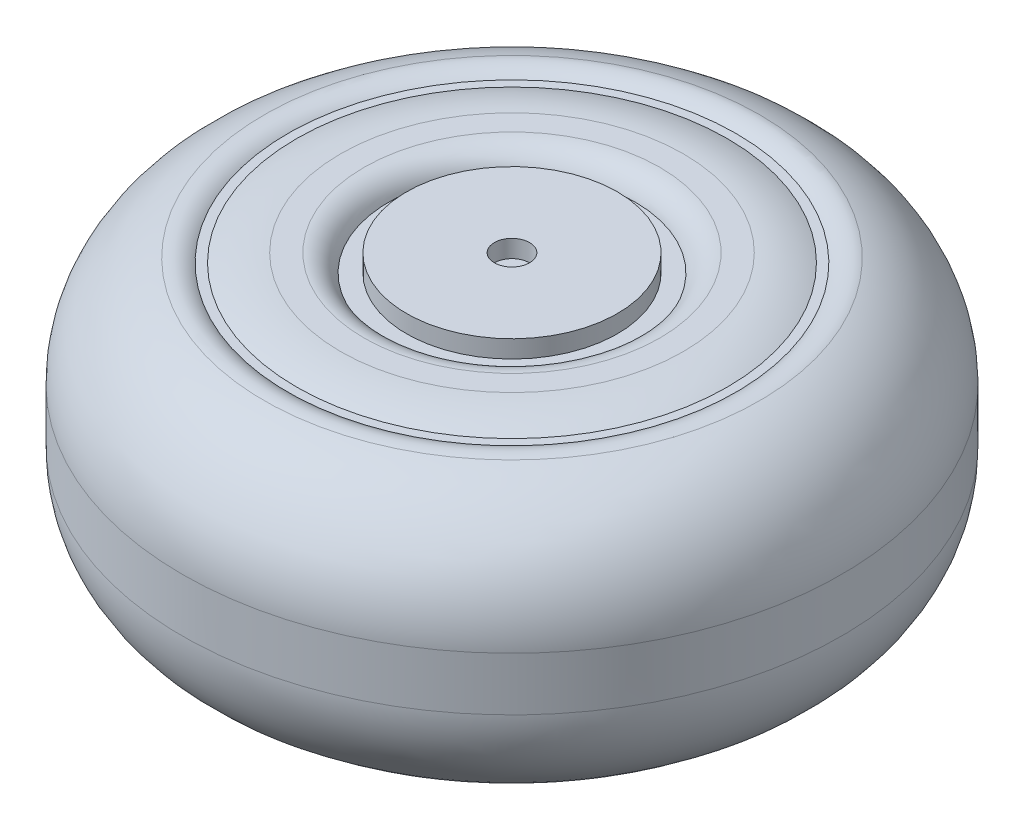
ISO-10303-21;
HEADER;
FILE_DESCRIPTION(('STEP AP214'),'2;1');
FILE_NAME('part.step','',(''),(''),'','','');
FILE_SCHEMA(('AUTOMOTIVE_DESIGN { 1 0 10303 214 1 1 1 1 }'));
ENDSEC;
DATA;
#1=APPLICATION_CONTEXT('core data for automotive mechanical design processes');
#2=APPLICATION_PROTOCOL_DEFINITION('international standard','automotive_design',2000,#1);
#3=PRODUCT_CONTEXT('',#1,'mechanical');
#4=PRODUCT('Part','Part','',(#3));
#5=PRODUCT_RELATED_PRODUCT_CATEGORY('part','',(#4));
#6=PRODUCT_DEFINITION_FORMATION('','',#4);
#7=PRODUCT_DEFINITION_CONTEXT('part definition',#1,'design');
#8=PRODUCT_DEFINITION('design','',#6,#7);
#9=PRODUCT_DEFINITION_SHAPE('','',#8);
#10=(LENGTH_UNIT() NAMED_UNIT(*) SI_UNIT(.MILLI.,.METRE.));
#11=(NAMED_UNIT(*) PLANE_ANGLE_UNIT() SI_UNIT($,.RADIAN.));
#12=(NAMED_UNIT(*) SI_UNIT($,.STERADIAN.) SOLID_ANGLE_UNIT());
#13=UNCERTAINTY_MEASURE_WITH_UNIT(LENGTH_MEASURE(1.E-05),#10,'distance_accuracy_value','');
#14=(GEOMETRIC_REPRESENTATION_CONTEXT(3) GLOBAL_UNCERTAINTY_ASSIGNED_CONTEXT((#13)) GLOBAL_UNIT_ASSIGNED_CONTEXT((#10,
#11,#12)) REPRESENTATION_CONTEXT('',''));
#15=CARTESIAN_POINT('',(0.,0.,0.));
#16=DIRECTION('',(0.,0.,1.));
#17=DIRECTION('',(1.,0.,0.));
#18=AXIS2_PLACEMENT_3D('',#15,#16,#17);
#19=CARTESIAN_POINT('',(0.,2.,-37.5));
#20=DIRECTION('',(0.,-1.,0.));
#21=DIRECTION('',(0.,0.,-1.));
#22=AXIS2_PLACEMENT_3D('',#19,#20,#21);
#23=CYLINDRICAL_SURFACE('',#22,25.5);
#24=CARTESIAN_POINT('',(0.,1.,-37.5));
#25=DIRECTION('',(0.,-1.,0.));
#26=DIRECTION('',(0.,0.,-1.));
#27=AXIS2_PLACEMENT_3D('',#24,#25,#26);
#28=CIRCLE('',#27,25.5);
#29=CARTESIAN_POINT('',(0.,1.,-63.));
#30=VERTEX_POINT('',#29);
#31=EDGE_CURVE('E63',#30,#30,#28,.T.);
#32=ORIENTED_EDGE('',*,*,#31,.F.);
#33=EDGE_LOOP('',(#32));
#34=FACE_BOUND('',#33,.T.);
#35=CARTESIAN_POINT('',(0.,0.,-37.5));
#36=DIRECTION('',(0.,-1.,0.));
#37=DIRECTION('',(0.,0.,-1.));
#38=AXIS2_PLACEMENT_3D('',#35,#36,#37);
#39=CIRCLE('',#38,25.5);
#40=CARTESIAN_POINT('',(0.,0.,-63.));
#41=VERTEX_POINT('',#40);
#42=EDGE_CURVE('E60',#41,#41,#39,.T.);
#43=ORIENTED_EDGE('',*,*,#42,.T.);
#44=EDGE_LOOP('',(#43));
#45=FACE_BOUND('',#44,.T.);
#46=ADVANCED_FACE('F34',(#34,#45),#23,.F.);
#47=CARTESIAN_POINT('',(0.,1.,-12.));
#48=DIRECTION('',(0.,1.,0.));
#49=DIRECTION('',(0.,0.,1.));
#50=AXIS2_PLACEMENT_3D('',#47,#48,#49);
#51=PLANE('',#50);
#52=CARTESIAN_POINT('',(0.,1.,-37.5));
#53=DIRECTION('',(0.,-1.,0.));
#54=DIRECTION('',(0.,0.,-1.));
#55=AXIS2_PLACEMENT_3D('',#52,#53,#54);
#56=CIRCLE('',#55,24.5);
#57=CARTESIAN_POINT('',(0.,1.,-62.));
#58=VERTEX_POINT('',#57);
#59=EDGE_CURVE('E66',#58,#58,#56,.T.);
#60=ORIENTED_EDGE('',*,*,#59,.F.);
#61=EDGE_LOOP('',(#60));
#62=FACE_BOUND('',#61,.T.);
#63=ORIENTED_EDGE('',*,*,#31,.T.);
#64=EDGE_LOOP('',(#63));
#65=FACE_BOUND('',#64,.T.);
#66=ADVANCED_FACE('F135',(#62,#65),#51,.F.);
#67=CARTESIAN_POINT('',(0.,0.,-13.));
#68=DIRECTION('',(0.,1.,0.));
#69=DIRECTION('',(0.,0.,1.));
#70=AXIS2_PLACEMENT_3D('',#67,#68,#69);
#71=PLANE('',#70);
#72=CARTESIAN_POINT('',(0.,0.,-37.5));
#73=DIRECTION('',(0.,1.,0.));
#74=DIRECTION('',(0.,0.,1.));
#75=AXIS2_PLACEMENT_3D('',#72,#73,#74);
#76=CIRCLE('',#75,19.5);
#77=CARTESIAN_POINT('',(0.,0.,-18.));
#78=VERTEX_POINT('',#77);
#79=EDGE_CURVE('E49',#78,#78,#76,.F.);
#80=ORIENTED_EDGE('',*,*,#79,.T.);
#81=EDGE_LOOP('',(#80));
#82=FACE_BOUND('',#81,.T.);
#83=CARTESIAN_POINT('',(0.,0.,-37.5));
#84=DIRECTION('',(0.,-1.,0.));
#85=DIRECTION('',(0.,0.,-1.));
#86=AXIS2_PLACEMENT_3D('',#83,#84,#85);
#87=CIRCLE('',#86,14.);
#88=CARTESIAN_POINT('',(0.,0.,-51.5));
#89=VERTEX_POINT('',#88);
#90=EDGE_CURVE('E69',#89,#89,#87,.T.);
#91=ORIENTED_EDGE('',*,*,#90,.F.);
#92=EDGE_LOOP('',(#91));
#93=FACE_BOUND('',#92,.T.);
#94=ADVANCED_FACE('F141',(#82,#93),#71,.F.);
#95=CARTESIAN_POINT('',(0.,2.,-37.5));
#96=DIRECTION('',(0.,-1.,0.));
#97=DIRECTION('',(0.,0.,-1.));
#98=AXIS2_PLACEMENT_3D('',#95,#96,#97);
#99=CYLINDRICAL_SURFACE('',#98,14.);
#100=CARTESIAN_POINT('',(0.,2.,-37.5));
#101=DIRECTION('',(0.,-1.,0.));
#102=DIRECTION('',(0.,0.,-1.));
#103=AXIS2_PLACEMENT_3D('',#100,#101,#102);
#104=CIRCLE('',#103,14.);
#105=CARTESIAN_POINT('',(0.,2.,-51.5));
#106=VERTEX_POINT('',#105);
#107=EDGE_CURVE('E72',#106,#106,#104,.T.);
#108=ORIENTED_EDGE('',*,*,#107,.F.);
#109=EDGE_LOOP('',(#108));
#110=FACE_BOUND('',#109,.T.);
#111=ORIENTED_EDGE('',*,*,#90,.T.);
#112=EDGE_LOOP('',(#111));
#113=FACE_BOUND('',#112,.T.);
#114=ADVANCED_FACE('F205',(#110,#113),#99,.F.);
#115=CARTESIAN_POINT('',(0.,2.,-23.5));
#116=DIRECTION('',(0.,1.,0.));
#117=DIRECTION('',(0.,0.,1.));
#118=AXIS2_PLACEMENT_3D('',#115,#116,#117);
#119=PLANE('',#118);
#120=CARTESIAN_POINT('',(0.,2.,-37.5));
#121=DIRECTION('',(0.,-1.,0.));
#122=DIRECTION('',(0.,0.,-1.));
#123=AXIS2_PLACEMENT_3D('',#120,#121,#122);
#124=CIRCLE('',#123,12.);
#125=CARTESIAN_POINT('',(0.,2.,-49.5));
#126=VERTEX_POINT('',#125);
#127=EDGE_CURVE('E75',#126,#126,#124,.T.);
#128=ORIENTED_EDGE('',*,*,#127,.F.);
#129=EDGE_LOOP('',(#128));
#130=FACE_BOUND('',#129,.T.);
#131=ORIENTED_EDGE('',*,*,#107,.T.);
#132=EDGE_LOOP('',(#131));
#133=FACE_BOUND('',#132,.T.);
#134=ADVANCED_FACE('F201',(#130,#133),#119,.F.);
#135=CARTESIAN_POINT('',(0.,2.,-37.5));
#136=DIRECTION('',(0.,-1.,0.));
#137=DIRECTION('',(0.,0.,-1.));
#138=AXIS2_PLACEMENT_3D('',#135,#136,#137);
#139=CYLINDRICAL_SURFACE('',#138,12.);
#140=CARTESIAN_POINT('',(0.,0.,-37.5));
#141=DIRECTION('',(0.,-1.,0.));
#142=DIRECTION('',(0.,0.,-1.));
#143=AXIS2_PLACEMENT_3D('',#140,#141,#142);
#144=CIRCLE('',#143,12.);
#145=CARTESIAN_POINT('',(0.,0.,-49.5));
#146=VERTEX_POINT('',#145);
#147=EDGE_CURVE('E78',#146,#146,#144,.T.);
#148=ORIENTED_EDGE('',*,*,#147,.F.);
#149=EDGE_LOOP('',(#148));
#150=FACE_BOUND('',#149,.T.);
#151=ORIENTED_EDGE('',*,*,#127,.T.);
#152=EDGE_LOOP('',(#151));
#153=FACE_BOUND('',#152,.T.);
#154=ADVANCED_FACE('F197',(#150,#153),#139,.T.);
#155=CARTESIAN_POINT('',(0.,0.,-25.5));
#156=DIRECTION('',(0.,1.,0.));
#157=DIRECTION('',(0.,0.,1.));
#158=AXIS2_PLACEMENT_3D('',#155,#156,#157);
#159=PLANE('',#158);
#160=CARTESIAN_POINT('',(0.,0.,-37.5));
#161=DIRECTION('',(0.,-1.,0.));
#162=DIRECTION('',(0.,0.,-1.));
#163=AXIS2_PLACEMENT_3D('',#160,#161,#162);
#164=CIRCLE('',#163,2.);
#165=CARTESIAN_POINT('',(0.,0.,-39.5));
#166=VERTEX_POINT('',#165);
#167=EDGE_CURVE('E81',#166,#166,#164,.T.);
#168=ORIENTED_EDGE('',*,*,#167,.F.);
#169=EDGE_LOOP('',(#168));
#170=FACE_BOUND('',#169,.T.);
#171=ORIENTED_EDGE('',*,*,#147,.T.);
#172=EDGE_LOOP('',(#171));
#173=FACE_BOUND('',#172,.T.);
#174=ADVANCED_FACE('F193',(#170,#173),#159,.F.);
#175=CARTESIAN_POINT('',(0.,2.,-37.5));
#176=DIRECTION('',(0.,-1.,0.));
#177=DIRECTION('',(0.,0.,-1.));
#178=AXIS2_PLACEMENT_3D('',#175,#176,#177);
#179=CYLINDRICAL_SURFACE('',#178,2.);
#180=CARTESIAN_POINT('',(0.,2.,-37.5));
#181=DIRECTION('',(0.,-1.,0.));
#182=DIRECTION('',(0.,0.,-1.));
#183=AXIS2_PLACEMENT_3D('',#180,#181,#182);
#184=CIRCLE('',#183,2.);
#185=CARTESIAN_POINT('',(0.,2.,-39.5));
#186=VERTEX_POINT('',#185);
#187=EDGE_CURVE('E84',#186,#186,#184,.T.);
#188=ORIENTED_EDGE('',*,*,#187,.F.);
#189=EDGE_LOOP('',(#188));
#190=FACE_BOUND('',#189,.T.);
#191=ORIENTED_EDGE('',*,*,#167,.T.);
#192=EDGE_LOOP('',(#191));
#193=FACE_BOUND('',#192,.T.);
#194=ADVANCED_FACE('F189',(#190,#193),#179,.F.);
#195=CARTESIAN_POINT('',(0.,2.,-37.5));
#196=DIRECTION('',(0.,1.,0.));
#197=DIRECTION('',(0.,0.,1.));
#198=AXIS2_PLACEMENT_3D('',#195,#196,#197);
#199=PLANE('',#198);
#200=ORIENTED_EDGE('',*,*,#187,.T.);
#201=EDGE_LOOP('',(#200));
#202=FACE_BOUND('',#201,.T.);
#203=ADVANCED_FACE('F185',(#202),#199,.F.);
#204=CARTESIAN_POINT('',(0.,30.,-37.5));
#205=DIRECTION('',(0.,-1.,0.));
#206=DIRECTION('',(0.,0.,-1.));
#207=AXIS2_PLACEMENT_3D('',#204,#205,#206);
#208=PLANE('',#207);
#209=CARTESIAN_POINT('',(0.,30.,-37.5));
#210=DIRECTION('',(0.,-1.,0.));
#211=DIRECTION('',(0.,0.,-1.));
#212=AXIS2_PLACEMENT_3D('',#209,#210,#211);
#213=CIRCLE('',#212,2.);
#214=CARTESIAN_POINT('',(0.,30.,-39.5));
#215=VERTEX_POINT('',#214);
#216=EDGE_CURVE('E87',#215,#215,#213,.T.);
#217=ORIENTED_EDGE('',*,*,#216,.F.);
#218=EDGE_LOOP('',(#217));
#219=FACE_BOUND('',#218,.T.);
#220=ADVANCED_FACE('F181',(#219),#208,.F.);
#221=CARTESIAN_POINT('',(0.,2.,-37.5));
#222=DIRECTION('',(0.,-1.,0.));
#223=DIRECTION('',(0.,0.,-1.));
#224=AXIS2_PLACEMENT_3D('',#221,#222,#223);
#225=CYLINDRICAL_SURFACE('',#224,2.);
#226=CARTESIAN_POINT('',(0.,32.,-37.5));
#227=DIRECTION('',(0.,-1.,0.));
#228=DIRECTION('',(0.,0.,-1.));
#229=AXIS2_PLACEMENT_3D('',#226,#227,#228);
#230=CIRCLE('',#229,2.);
#231=CARTESIAN_POINT('',(0.,32.,-39.5));
#232=VERTEX_POINT('',#231);
#233=EDGE_CURVE('E90',#232,#232,#230,.T.);
#234=ORIENTED_EDGE('',*,*,#233,.F.);
#235=EDGE_LOOP('',(#234));
#236=FACE_BOUND('',#235,.T.);
#237=ORIENTED_EDGE('',*,*,#216,.T.);
#238=EDGE_LOOP('',(#237));
#239=FACE_BOUND('',#238,.T.);
#240=ADVANCED_FACE('F177',(#236,#239),#225,.F.);
#241=CARTESIAN_POINT('',(0.,32.,-25.5));
#242=DIRECTION('',(0.,-1.,0.));
#243=DIRECTION('',(0.,0.,-1.));
#244=AXIS2_PLACEMENT_3D('',#241,#242,#243);
#245=PLANE('',#244);
#246=CARTESIAN_POINT('',(0.,32.,-37.5));
#247=DIRECTION('',(0.,-1.,0.));
#248=DIRECTION('',(0.,0.,-1.));
#249=AXIS2_PLACEMENT_3D('',#246,#247,#248);
#250=CIRCLE('',#249,12.);
#251=CARTESIAN_POINT('',(0.,32.,-49.5));
#252=VERTEX_POINT('',#251);
#253=EDGE_CURVE('E93',#252,#252,#250,.T.);
#254=ORIENTED_EDGE('',*,*,#253,.F.);
#255=EDGE_LOOP('',(#254));
#256=FACE_BOUND('',#255,.T.);
#257=ORIENTED_EDGE('',*,*,#233,.T.);
#258=EDGE_LOOP('',(#257));
#259=FACE_BOUND('',#258,.T.);
#260=ADVANCED_FACE('F173',(#256,#259),#245,.F.);
#261=CARTESIAN_POINT('',(0.,2.,-37.5));
#262=DIRECTION('',(0.,-1.,0.));
#263=DIRECTION('',(0.,0.,-1.));
#264=AXIS2_PLACEMENT_3D('',#261,#262,#263);
#265=CYLINDRICAL_SURFACE('',#264,12.);
#266=CARTESIAN_POINT('',(0.,30.,-37.5));
#267=DIRECTION('',(0.,-1.,0.));
#268=DIRECTION('',(0.,0.,-1.));
#269=AXIS2_PLACEMENT_3D('',#266,#267,#268);
#270=CIRCLE('',#269,12.);
#271=CARTESIAN_POINT('',(0.,30.,-49.5));
#272=VERTEX_POINT('',#271);
#273=EDGE_CURVE('E96',#272,#272,#270,.T.);
#274=ORIENTED_EDGE('',*,*,#273,.F.);
#275=EDGE_LOOP('',(#274));
#276=FACE_BOUND('',#275,.T.);
#277=ORIENTED_EDGE('',*,*,#253,.T.);
#278=EDGE_LOOP('',(#277));
#279=FACE_BOUND('',#278,.T.);
#280=ADVANCED_FACE('F169',(#276,#279),#265,.T.);
#281=CARTESIAN_POINT('',(0.,30.,-23.5));
#282=DIRECTION('',(0.,-1.,0.));
#283=DIRECTION('',(0.,0.,-1.));
#284=AXIS2_PLACEMENT_3D('',#281,#282,#283);
#285=PLANE('',#284);
#286=CARTESIAN_POINT('',(0.,30.,-37.5));
#287=DIRECTION('',(0.,-1.,0.));
#288=DIRECTION('',(0.,0.,-1.));
#289=AXIS2_PLACEMENT_3D('',#286,#287,#288);
#290=CIRCLE('',#289,14.);
#291=CARTESIAN_POINT('',(0.,30.,-51.5));
#292=VERTEX_POINT('',#291);
#293=EDGE_CURVE('E99',#292,#292,#290,.T.);
#294=ORIENTED_EDGE('',*,*,#293,.F.);
#295=EDGE_LOOP('',(#294));
#296=FACE_BOUND('',#295,.T.);
#297=ORIENTED_EDGE('',*,*,#273,.T.);
#298=EDGE_LOOP('',(#297));
#299=FACE_BOUND('',#298,.T.);
#300=ADVANCED_FACE('F166',(#296,#299),#285,.F.);
#301=CARTESIAN_POINT('',(0.,32.,-13.));
#302=DIRECTION('',(0.,-1.,0.));
#303=DIRECTION('',(0.,0.,-1.));
#304=AXIS2_PLACEMENT_3D('',#301,#302,#303);
#305=PLANE('',#304);
#306=CARTESIAN_POINT('',(0.,32.,-37.5));
#307=DIRECTION('',(0.,-1.,0.));
#308=DIRECTION('',(0.,0.,-1.));
#309=AXIS2_PLACEMENT_3D('',#306,#307,#308);
#310=CIRCLE('',#309,16.8284271247462);
#311=CARTESIAN_POINT('',(0.,32.,-54.3284271247462));
#312=VERTEX_POINT('',#311);
#313=EDGE_CURVE('E41',#312,#312,#310,.T.);
#314=ORIENTED_EDGE('',*,*,#313,.T.);
#315=EDGE_LOOP('',(#314));
#316=FACE_BOUND('',#315,.T.);
#317=CARTESIAN_POINT('',(0.,32.,-37.5));
#318=DIRECTION('',(0.,-1.,0.));
#319=DIRECTION('',(0.,0.,-1.));
#320=AXIS2_PLACEMENT_3D('',#317,#318,#319);
#321=CIRCLE('',#320,19.5);
#322=CARTESIAN_POINT('',(0.,32.,-57.));
#323=VERTEX_POINT('',#322);
#324=EDGE_CURVE('E45',#323,#323,#321,.F.);
#325=ORIENTED_EDGE('',*,*,#324,.T.);
#326=EDGE_LOOP('',(#325));
#327=FACE_BOUND('',#326,.T.);
#328=ADVANCED_FACE('F115',(#316,#327),#305,.F.);
#329=CARTESIAN_POINT('',(0.,31.,-12.));
#330=DIRECTION('',(0.,-1.,0.));
#331=DIRECTION('',(0.,0.,-1.));
#332=AXIS2_PLACEMENT_3D('',#329,#330,#331);
#333=PLANE('',#332);
#334=CARTESIAN_POINT('',(0.,31.,-37.5));
#335=DIRECTION('',(0.,-1.,0.));
#336=DIRECTION('',(0.,0.,-1.));
#337=AXIS2_PLACEMENT_3D('',#334,#335,#336);
#338=CIRCLE('',#337,25.5);
#339=CARTESIAN_POINT('',(0.,31.,-63.));
#340=VERTEX_POINT('',#339);
#341=EDGE_CURVE('E105',#340,#340,#338,.T.);
#342=ORIENTED_EDGE('',*,*,#341,.F.);
#343=EDGE_LOOP('',(#342));
#344=FACE_BOUND('',#343,.T.);
#345=CARTESIAN_POINT('',(0.,31.,-37.5));
#346=DIRECTION('',(0.,-1.,0.));
#347=DIRECTION('',(0.,0.,-1.));
#348=AXIS2_PLACEMENT_3D('',#345,#346,#347);
#349=CIRCLE('',#348,24.5);
#350=CARTESIAN_POINT('',(0.,31.,-62.));
#351=VERTEX_POINT('',#350);
#352=EDGE_CURVE('E102',#351,#351,#349,.T.);
#353=ORIENTED_EDGE('',*,*,#352,.T.);
#354=EDGE_LOOP('',(#353));
#355=FACE_BOUND('',#354,.T.);
#356=ADVANCED_FACE('F111',(#344,#355),#333,.F.);
#357=CARTESIAN_POINT('',(0.,2.,-37.5));
#358=DIRECTION('',(0.,-1.,0.));
#359=DIRECTION('',(0.,0.,-1.));
#360=AXIS2_PLACEMENT_3D('',#357,#358,#359);
#361=CYLINDRICAL_SURFACE('',#360,37.5);
#362=CARTESIAN_POINT('',(0.,12.9614813968157,-37.5));
#363=DIRECTION('',(0.,-1.,0.));
#364=DIRECTION('',(0.,0.,-1.));
#365=AXIS2_PLACEMENT_3D('',#362,#363,#364);
#366=CIRCLE('',#365,37.5);
#367=CARTESIAN_POINT('',(0.,12.9614813968157,-75.));
#368=VERTEX_POINT('',#367);
#369=EDGE_CURVE('E54',#368,#368,#366,.F.);
#370=ORIENTED_EDGE('',*,*,#369,.T.);
#371=EDGE_LOOP('',(#370));
#372=FACE_BOUND('',#371,.T.);
#373=CARTESIAN_POINT('',(0.,19.0385186031843,-37.5));
#374=DIRECTION('',(0.,1.,0.));
#375=DIRECTION('',(0.,0.,1.));
#376=AXIS2_PLACEMENT_3D('',#373,#374,#375);
#377=CIRCLE('',#376,37.5);
#378=CARTESIAN_POINT('',(0.,19.0385186031843,0.));
#379=VERTEX_POINT('',#378);
#380=EDGE_CURVE('E57',#379,#379,#377,.F.);
#381=ORIENTED_EDGE('',*,*,#380,.T.);
#382=EDGE_LOOP('',(#381));
#383=FACE_BOUND('',#382,.T.);
#384=ADVANCED_FACE('F114',(#372,#383),#361,.T.);
#385=CARTESIAN_POINT('',(0.,12.9614813968157,-37.5));
#386=DIRECTION('',(0.,-1.,0.));
#387=DIRECTION('',(0.,0.,-1.));
#388=AXIS2_PLACEMENT_3D('',#385,#386,#387);
#389=TOROIDAL_SURFACE('',#388,24.5,13.);
#390=ORIENTED_EDGE('',*,*,#369,.F.);
#391=EDGE_LOOP('',(#390));
#392=FACE_BOUND('',#391,.T.);
#393=ORIENTED_EDGE('',*,*,#42,.F.);
#394=EDGE_LOOP('',(#393));
#395=FACE_BOUND('',#394,.T.);
#396=ADVANCED_FACE('F148',(#392,#395),#389,.T.);
#397=CARTESIAN_POINT('',(0.,19.0385186031843,-37.5));
#398=DIRECTION('',(0.,1.,0.));
#399=DIRECTION('',(0.,0.,1.));
#400=AXIS2_PLACEMENT_3D('',#397,#398,#399);
#401=TOROIDAL_SURFACE('',#400,24.5,13.);
#402=CARTESIAN_POINT('',(0.,31.5045868994989,-37.5));
#403=DIRECTION('',(0.,-1.,0.));
#404=DIRECTION('',(0.,0.,-1.));
#405=AXIS2_PLACEMENT_3D('',#402,#403,#404);
#406=CIRCLE('',#405,28.187430166338);
#407=CARTESIAN_POINT('',(0.,31.5045868994989,-65.687430166338));
#408=VERTEX_POINT('',#407);
#409=EDGE_CURVE('E10',#408,#408,#406,.T.);
#410=ORIENTED_EDGE('',*,*,#409,.T.);
#411=EDGE_LOOP('',(#410));
#412=FACE_BOUND('',#411,.T.);
#413=ORIENTED_EDGE('',*,*,#380,.F.);
#414=EDGE_LOOP('',(#413));
#415=FACE_BOUND('',#414,.T.);
#416=ADVANCED_FACE('F130',(#412,#415),#401,.T.);
#417=CARTESIAN_POINT('',(0.,13.,-37.5));
#418=DIRECTION('',(0.,-1.,0.));
#419=DIRECTION('',(0.,0.,-1.));
#420=AXIS2_PLACEMENT_3D('',#417,#418,#419);
#421=TOROIDAL_SURFACE('',#420,19.5,13.);
#422=ORIENTED_EDGE('',*,*,#59,.T.);
#423=EDGE_LOOP('',(#422));
#424=FACE_BOUND('',#423,.T.);
#425=ORIENTED_EDGE('',*,*,#79,.F.);
#426=EDGE_LOOP('',(#425));
#427=FACE_BOUND('',#426,.T.);
#428=ADVANCED_FACE('F122',(#424,#427),#421,.T.);
#429=CARTESIAN_POINT('',(0.,19.,-37.5));
#430=DIRECTION('',(0.,1.,0.));
#431=DIRECTION('',(0.,0.,1.));
#432=AXIS2_PLACEMENT_3D('',#429,#430,#431);
#433=TOROIDAL_SURFACE('',#432,19.5,13.);
#434=ORIENTED_EDGE('',*,*,#324,.F.);
#435=EDGE_LOOP('',(#434));
#436=FACE_BOUND('',#435,.T.);
#437=ORIENTED_EDGE('',*,*,#352,.F.);
#438=EDGE_LOOP('',(#437));
#439=FACE_BOUND('',#438,.T.);
#440=ADVANCED_FACE('F119',(#436,#439),#433,.T.);
#441=CARTESIAN_POINT('',(0.,29.,-37.5));
#442=DIRECTION('',(0.,-1.,0.));
#443=DIRECTION('',(0.,0.,-1.));
#444=AXIS2_PLACEMENT_3D('',#441,#442,#443);
#445=TOROIDAL_SURFACE('',#444,16.8284271247462,3.);
#446=ORIENTED_EDGE('',*,*,#293,.T.);
#447=EDGE_LOOP('',(#446));
#448=FACE_BOUND('',#447,.T.);
#449=ORIENTED_EDGE('',*,*,#313,.F.);
#450=EDGE_LOOP('',(#449));
#451=FACE_BOUND('',#450,.T.);
#452=ADVANCED_FACE('F121',(#448,#451),#445,.T.);
#453=CARTESIAN_POINT('',(0.,28.6278019080417,-37.5));
#454=DIRECTION('',(0.,1.,0.));
#455=DIRECTION('',(0.,0.,1.));
#456=AXIS2_PLACEMENT_3D('',#453,#454,#455);
#457=TOROIDAL_SURFACE('',#456,27.3364847433369,3.);
#458=ORIENTED_EDGE('',*,*,#341,.T.);
#459=EDGE_LOOP('',(#458));
#460=FACE_BOUND('',#459,.T.);
#461=ORIENTED_EDGE('',*,*,#409,.F.);
#462=EDGE_LOOP('',(#461));
#463=FACE_BOUND('',#462,.T.);
#464=ADVANCED_FACE('F36',(#460,#463),#457,.T.);
#465=CLOSED_SHELL('',(#46,#66,#94,#114,#134,#154,#174,#194,#203,#220,#240,#260,#280,#300,#328,
#356,#384,#396,#416,#428,#440,#452,#464));
#466=MANIFOLD_SOLID_BREP('B2',#465);
#467=ADVANCED_BREP_SHAPE_REPRESENTATION('',(#18,#466),#14);
#468=SHAPE_DEFINITION_REPRESENTATION(#9,#467);
ENDSEC;
END-ISO-10303-21;
